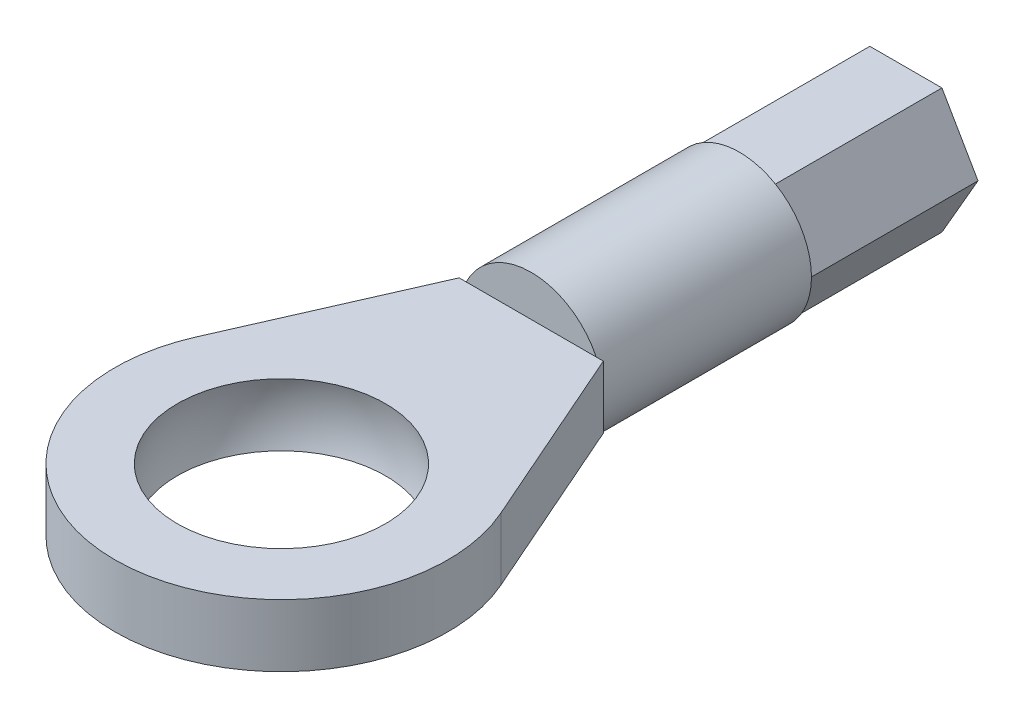
ISO-10303-21;
HEADER;
FILE_DESCRIPTION(('STEP AP214'),'2;1');
FILE_NAME('part.step','',(''),(''),'','','');
FILE_SCHEMA(('AUTOMOTIVE_DESIGN { 1 0 10303 214 1 1 1 1 }'));
ENDSEC;
DATA;
#1=APPLICATION_CONTEXT('core data for automotive mechanical design processes');
#2=APPLICATION_PROTOCOL_DEFINITION('international standard','automotive_design',2000,#1);
#3=PRODUCT_CONTEXT('',#1,'mechanical');
#4=PRODUCT('Part','Part','',(#3));
#5=PRODUCT_RELATED_PRODUCT_CATEGORY('part','',(#4));
#6=PRODUCT_DEFINITION_FORMATION('','',#4);
#7=PRODUCT_DEFINITION_CONTEXT('part definition',#1,'design');
#8=PRODUCT_DEFINITION('design','',#6,#7);
#9=PRODUCT_DEFINITION_SHAPE('','',#8);
#10=(LENGTH_UNIT() NAMED_UNIT(*) SI_UNIT(.MILLI.,.METRE.));
#11=(NAMED_UNIT(*) PLANE_ANGLE_UNIT() SI_UNIT($,.RADIAN.));
#12=(NAMED_UNIT(*) SI_UNIT($,.STERADIAN.) SOLID_ANGLE_UNIT());
#13=UNCERTAINTY_MEASURE_WITH_UNIT(LENGTH_MEASURE(1.E-05),#10,'distance_accuracy_value','');
#14=(GEOMETRIC_REPRESENTATION_CONTEXT(3) GLOBAL_UNCERTAINTY_ASSIGNED_CONTEXT((#13)) GLOBAL_UNIT_ASSIGNED_CONTEXT((#10,
#11,#12)) REPRESENTATION_CONTEXT('',''));
#15=CARTESIAN_POINT('',(0.,0.,0.));
#16=DIRECTION('',(0.,0.,1.));
#17=DIRECTION('',(1.,0.,0.));
#18=AXIS2_PLACEMENT_3D('',#15,#16,#17);
#19=CARTESIAN_POINT('',(0.,0.,9.));
#20=DIRECTION('',(0.,0.,1.));
#21=DIRECTION('',(1.,0.,0.));
#22=AXIS2_PLACEMENT_3D('',#19,#20,#21);
#23=PLANE('',#22);
#24=CARTESIAN_POINT('',(0.,0.,9.));
#25=DIRECTION('',(0.,0.,1.));
#26=DIRECTION('',(1.,0.,0.));
#27=AXIS2_PLACEMENT_3D('',#24,#25,#26);
#28=CIRCLE('',#27,1.73205080756888);
#29=CARTESIAN_POINT('',(-1.5612494995996,-0.75,9.));
#30=VERTEX_POINT('',#29);
#31=CARTESIAN_POINT('',(1.5612494995996,-0.75,9.));
#32=VERTEX_POINT('',#31);
#33=EDGE_CURVE('E282',#30,#32,#28,.T.);
#34=ORIENTED_EDGE('',*,*,#33,.T.);
#35=DIRECTION('',(-1.,0.,0.));
#36=VECTOR('',#35,1.);
#37=CARTESIAN_POINT('',(-1.73205080756888,-0.75,9.));
#38=LINE('',#37,#36);
#39=EDGE_CURVE('E43',#32,#30,#38,.T.);
#40=ORIENTED_EDGE('',*,*,#39,.T.);
#41=EDGE_LOOP('',(#34,#40));
#42=FACE_BOUND('',#41,.T.);
#43=ADVANCED_FACE('F34',(#42),#23,.T.);
#44=CARTESIAN_POINT('',(0.,0.,0.));
#45=DIRECTION('',(0.,0.,1.));
#46=DIRECTION('',(1.,0.,0.));
#47=AXIS2_PLACEMENT_3D('',#44,#45,#46);
#48=PLANE('',#47);
#49=DIRECTION('',(-0.5,0.866025403784439,0.));
#50=VECTOR('',#49,1.);
#51=CARTESIAN_POINT('',(1.73205080756888,0.,0.));
#52=LINE('',#51,#50);
#53=CARTESIAN_POINT('',(1.73205080756888,0.,0.));
#54=VERTEX_POINT('',#53);
#55=CARTESIAN_POINT('',(0.866025403784439,1.5,0.));
#56=VERTEX_POINT('',#55);
#57=EDGE_CURVE('E160',#54,#56,#52,.T.);
#58=ORIENTED_EDGE('',*,*,#57,.F.);
#59=DIRECTION('',(0.5,0.866025403784439,0.));
#60=VECTOR('',#59,1.);
#61=CARTESIAN_POINT('',(0.866025403784439,-1.5,0.));
#62=LINE('',#61,#60);
#63=CARTESIAN_POINT('',(0.866025403784439,-1.5,0.));
#64=VERTEX_POINT('',#63);
#65=EDGE_CURVE('E89',#64,#54,#62,.T.);
#66=ORIENTED_EDGE('',*,*,#65,.F.);
#67=DIRECTION('',(1.,0.,0.));
#68=VECTOR('',#67,1.);
#69=CARTESIAN_POINT('',(-0.866025403784437,-1.5,0.));
#70=LINE('',#69,#68);
#71=CARTESIAN_POINT('',(-0.866025403784437,-1.5,0.));
#72=VERTEX_POINT('',#71);
#73=EDGE_CURVE('E178',#72,#64,#70,.T.);
#74=ORIENTED_EDGE('',*,*,#73,.F.);
#75=DIRECTION('',(0.5,-0.866025403784439,0.));
#76=VECTOR('',#75,1.);
#77=CARTESIAN_POINT('',(-1.73205080756888,0.,0.));
#78=LINE('',#77,#76);
#79=CARTESIAN_POINT('',(-1.73205080756888,0.,0.));
#80=VERTEX_POINT('',#79);
#81=EDGE_CURVE('E176',#80,#72,#78,.T.);
#82=ORIENTED_EDGE('',*,*,#81,.F.);
#83=DIRECTION('',(-0.5,-0.866025403784439,0.));
#84=VECTOR('',#83,1.);
#85=CARTESIAN_POINT('',(-0.866025403784438,1.5,0.));
#86=LINE('',#85,#84);
#87=CARTESIAN_POINT('',(-0.866025403784438,1.5,0.));
#88=VERTEX_POINT('',#87);
#89=EDGE_CURVE('E114',#88,#80,#86,.T.);
#90=ORIENTED_EDGE('',*,*,#89,.F.);
#91=DIRECTION('',(-1.,0.,0.));
#92=VECTOR('',#91,1.);
#93=CARTESIAN_POINT('',(0.866025403784439,1.5,0.));
#94=LINE('',#93,#92);
#95=EDGE_CURVE('E173',#56,#88,#94,.T.);
#96=ORIENTED_EDGE('',*,*,#95,.F.);
#97=EDGE_LOOP('',(#58,#66,#74,#82,#90,#96));
#98=FACE_BOUND('',#97,.T.);
#99=CARTESIAN_POINT('',(0.,0.,0.));
#100=DIRECTION('',(0.,0.,1.));
#101=DIRECTION('',(1.,0.,0.));
#102=AXIS2_PLACEMENT_3D('',#99,#100,#101);
#103=CIRCLE('',#102,1.);
#104=CARTESIAN_POINT('',(1.,0.,0.));
#105=VERTEX_POINT('',#104);
#106=EDGE_CURVE('E157',#105,#105,#103,.T.);
#107=ORIENTED_EDGE('',*,*,#106,.T.);
#108=EDGE_LOOP('',(#107));
#109=FACE_BOUND('',#108,.T.);
#110=ADVANCED_FACE('F322',(#98,#109),#48,.F.);
#111=CARTESIAN_POINT('',(1.73205080756888,0.,4.));
#112=DIRECTION('',(-0.866025403784439,-0.5,0.));
#113=DIRECTION('',(0.5,-0.866025403784439,0.));
#114=AXIS2_PLACEMENT_3D('',#111,#112,#113);
#115=PLANE('',#114);
#116=ORIENTED_EDGE('',*,*,#57,.T.);
#117=DIRECTION('',(0.,0.,-1.));
#118=VECTOR('',#117,1.);
#119=CARTESIAN_POINT('',(0.866025403784439,1.5,4.));
#120=LINE('',#119,#118);
#121=CARTESIAN_POINT('',(0.866025403784439,1.5,4.));
#122=VERTEX_POINT('',#121);
#123=EDGE_CURVE('E38',#122,#56,#120,.T.);
#124=ORIENTED_EDGE('',*,*,#123,.F.);
#125=DIRECTION('',(-0.5,0.866025403784439,0.));
#126=VECTOR('',#125,1.);
#127=CARTESIAN_POINT('',(1.73205080756888,0.,4.));
#128=LINE('',#127,#126);
#129=CARTESIAN_POINT('',(1.73205080756888,0.,4.));
#130=VERTEX_POINT('',#129);
#131=EDGE_CURVE('E161',#130,#122,#128,.T.);
#132=ORIENTED_EDGE('',*,*,#131,.F.);
#133=DIRECTION('',(0.,0.,-1.));
#134=VECTOR('',#133,1.);
#135=CARTESIAN_POINT('',(1.73205080756888,0.,4.));
#136=LINE('',#135,#134);
#137=EDGE_CURVE('E170',#130,#54,#136,.T.);
#138=ORIENTED_EDGE('',*,*,#137,.T.);
#139=EDGE_LOOP('',(#116,#124,#132,#138));
#140=FACE_BOUND('',#139,.T.);
#141=ADVANCED_FACE('F36',(#140),#115,.F.);
#142=CARTESIAN_POINT('',(0.866025403784439,1.5,4.));
#143=DIRECTION('',(0.,-1.,0.));
#144=DIRECTION('',(1.,0.,0.));
#145=AXIS2_PLACEMENT_3D('',#142,#143,#144);
#146=PLANE('',#145);
#147=ORIENTED_EDGE('',*,*,#95,.T.);
#148=DIRECTION('',(0.,0.,-1.));
#149=VECTOR('',#148,1.);
#150=CARTESIAN_POINT('',(-0.866025403784438,1.5,4.));
#151=LINE('',#150,#149);
#152=CARTESIAN_POINT('',(-0.866025403784438,1.5,4.));
#153=VERTEX_POINT('',#152);
#154=EDGE_CURVE('E117',#153,#88,#151,.T.);
#155=ORIENTED_EDGE('',*,*,#154,.F.);
#156=DIRECTION('',(-1.,0.,0.));
#157=VECTOR('',#156,1.);
#158=CARTESIAN_POINT('',(0.866025403784439,1.5,4.));
#159=LINE('',#158,#157);
#160=EDGE_CURVE('E98',#122,#153,#159,.T.);
#161=ORIENTED_EDGE('',*,*,#160,.F.);
#162=ORIENTED_EDGE('',*,*,#123,.T.);
#163=EDGE_LOOP('',(#147,#155,#161,#162));
#164=FACE_BOUND('',#163,.T.);
#165=ADVANCED_FACE('F349',(#164),#146,.F.);
#166=CARTESIAN_POINT('',(-0.866025403784438,1.5,4.));
#167=DIRECTION('',(0.866025403784439,-0.5,0.));
#168=DIRECTION('',(0.5,0.866025403784439,0.));
#169=AXIS2_PLACEMENT_3D('',#166,#167,#168);
#170=PLANE('',#169);
#171=ORIENTED_EDGE('',*,*,#89,.T.);
#172=DIRECTION('',(0.,0.,-1.));
#173=VECTOR('',#172,1.);
#174=CARTESIAN_POINT('',(-1.73205080756888,0.,4.));
#175=LINE('',#174,#173);
#176=CARTESIAN_POINT('',(-1.73205080756888,0.,4.));
#177=VERTEX_POINT('',#176);
#178=EDGE_CURVE('E107',#177,#80,#175,.T.);
#179=ORIENTED_EDGE('',*,*,#178,.F.);
#180=DIRECTION('',(-0.5,-0.866025403784439,0.));
#181=VECTOR('',#180,1.);
#182=CARTESIAN_POINT('',(-0.866025403784438,1.5,4.));
#183=LINE('',#182,#181);
#184=EDGE_CURVE('E112',#153,#177,#183,.T.);
#185=ORIENTED_EDGE('',*,*,#184,.F.);
#186=ORIENTED_EDGE('',*,*,#154,.T.);
#187=EDGE_LOOP('',(#171,#179,#185,#186));
#188=FACE_BOUND('',#187,.T.);
#189=ADVANCED_FACE('F109',(#188),#170,.F.);
#190=CARTESIAN_POINT('',(-1.73205080756888,0.,4.));
#191=DIRECTION('',(0.866025403784439,0.5,0.));
#192=DIRECTION('',(-0.5,0.866025403784439,0.));
#193=AXIS2_PLACEMENT_3D('',#190,#191,#192);
#194=PLANE('',#193);
#195=ORIENTED_EDGE('',*,*,#81,.T.);
#196=DIRECTION('',(0.,0.,-1.));
#197=VECTOR('',#196,1.);
#198=CARTESIAN_POINT('',(-0.866025403784437,-1.5,4.));
#199=LINE('',#198,#197);
#200=CARTESIAN_POINT('',(-0.866025403784437,-1.5,4.));
#201=VERTEX_POINT('',#200);
#202=EDGE_CURVE('E118',#201,#72,#199,.T.);
#203=ORIENTED_EDGE('',*,*,#202,.F.);
#204=DIRECTION('',(0.5,-0.866025403784439,0.));
#205=VECTOR('',#204,1.);
#206=CARTESIAN_POINT('',(-1.73205080756888,0.,4.));
#207=LINE('',#206,#205);
#208=EDGE_CURVE('E121',#177,#201,#207,.T.);
#209=ORIENTED_EDGE('',*,*,#208,.F.);
#210=ORIENTED_EDGE('',*,*,#178,.T.);
#211=EDGE_LOOP('',(#195,#203,#209,#210));
#212=FACE_BOUND('',#211,.T.);
#213=ADVANCED_FACE('F122',(#212),#194,.F.);
#214=CARTESIAN_POINT('',(-0.866025403784437,-1.5,4.));
#215=DIRECTION('',(0.,1.,0.));
#216=DIRECTION('',(-1.,0.,0.));
#217=AXIS2_PLACEMENT_3D('',#214,#215,#216);
#218=PLANE('',#217);
#219=ORIENTED_EDGE('',*,*,#73,.T.);
#220=DIRECTION('',(0.,0.,-1.));
#221=VECTOR('',#220,1.);
#222=CARTESIAN_POINT('',(0.866025403784439,-1.5,4.));
#223=LINE('',#222,#221);
#224=CARTESIAN_POINT('',(0.866025403784439,-1.5,4.));
#225=VERTEX_POINT('',#224);
#226=EDGE_CURVE('E62',#225,#64,#223,.T.);
#227=ORIENTED_EDGE('',*,*,#226,.F.);
#228=DIRECTION('',(1.,0.,0.));
#229=VECTOR('',#228,1.);
#230=CARTESIAN_POINT('',(-0.866025403784437,-1.5,4.));
#231=LINE('',#230,#229);
#232=EDGE_CURVE('E127',#201,#225,#231,.T.);
#233=ORIENTED_EDGE('',*,*,#232,.F.);
#234=ORIENTED_EDGE('',*,*,#202,.T.);
#235=EDGE_LOOP('',(#219,#227,#233,#234));
#236=FACE_BOUND('',#235,.T.);
#237=ADVANCED_FACE('F343',(#236),#218,.F.);
#238=CARTESIAN_POINT('',(0.866025403784439,-1.5,4.));
#239=DIRECTION('',(-0.866025403784439,0.5,0.));
#240=DIRECTION('',(-0.5,-0.866025403784439,0.));
#241=AXIS2_PLACEMENT_3D('',#238,#239,#240);
#242=PLANE('',#241);
#243=ORIENTED_EDGE('',*,*,#65,.T.);
#244=ORIENTED_EDGE('',*,*,#137,.F.);
#245=DIRECTION('',(0.5,0.866025403784439,0.));
#246=VECTOR('',#245,1.);
#247=CARTESIAN_POINT('',(0.866025403784439,-1.5,4.));
#248=LINE('',#247,#246);
#249=EDGE_CURVE('E167',#225,#130,#248,.T.);
#250=ORIENTED_EDGE('',*,*,#249,.F.);
#251=ORIENTED_EDGE('',*,*,#226,.T.);
#252=EDGE_LOOP('',(#243,#244,#250,#251));
#253=FACE_BOUND('',#252,.T.);
#254=ADVANCED_FACE('F299',(#253),#242,.F.);
#255=CARTESIAN_POINT('',(0.,0.,4.));
#256=DIRECTION('',(0.,0.,-1.));
#257=DIRECTION('',(-1.,0.,0.));
#258=AXIS2_PLACEMENT_3D('',#255,#256,#257);
#259=CYLINDRICAL_SURFACE('',#258,1.);
#260=CARTESIAN_POINT('',(0.,0.,4.));
#261=DIRECTION('',(0.,0.,1.));
#262=DIRECTION('',(1.,0.,0.));
#263=AXIS2_PLACEMENT_3D('',#260,#261,#262);
#264=CIRCLE('',#263,1.);
#265=CARTESIAN_POINT('',(1.,0.,4.));
#266=VERTEX_POINT('',#265);
#267=EDGE_CURVE('E154',#266,#266,#264,.T.);
#268=ORIENTED_EDGE('',*,*,#267,.T.);
#269=EDGE_LOOP('',(#268));
#270=FACE_BOUND('',#269,.T.);
#271=ORIENTED_EDGE('',*,*,#106,.F.);
#272=EDGE_LOOP('',(#271));
#273=FACE_BOUND('',#272,.T.);
#274=ADVANCED_FACE('F314',(#270,#273),#259,.F.);
#275=CARTESIAN_POINT('',(0.,0.,4.));
#276=DIRECTION('',(0.,0.,1.));
#277=DIRECTION('',(1.,0.,0.));
#278=AXIS2_PLACEMENT_3D('',#275,#276,#277);
#279=PLANE('',#278);
#280=ORIENTED_EDGE('',*,*,#267,.F.);
#281=EDGE_LOOP('',(#280));
#282=FACE_BOUND('',#281,.T.);
#283=ADVANCED_FACE('F307',(#282),#279,.F.);
#284=CARTESIAN_POINT('',(0.,0.,4.));
#285=DIRECTION('',(0.,0.,1.));
#286=DIRECTION('',(1.,0.,0.));
#287=AXIS2_PLACEMENT_3D('',#284,#285,#286);
#288=CIRCLE('',#287,1.73205080756888);
#289=EDGE_CURVE('E147',#130,#122,#288,.T.);
#290=ORIENTED_EDGE('',*,*,#289,.F.);
#291=ORIENTED_EDGE('',*,*,#131,.T.);
#292=EDGE_LOOP('',(#290,#291));
#293=FACE_BOUND('',#292,.T.);
#294=ADVANCED_FACE('F304',(#293),#279,.F.);
#295=EDGE_CURVE('E146',#122,#153,#288,.T.);
#296=ORIENTED_EDGE('',*,*,#295,.F.);
#297=ORIENTED_EDGE('',*,*,#160,.T.);
#298=EDGE_LOOP('',(#296,#297));
#299=FACE_BOUND('',#298,.T.);
#300=ADVANCED_FACE('F306',(#299),#279,.F.);
#301=EDGE_CURVE('E133',#153,#177,#288,.T.);
#302=ORIENTED_EDGE('',*,*,#301,.F.);
#303=ORIENTED_EDGE('',*,*,#184,.T.);
#304=EDGE_LOOP('',(#302,#303));
#305=FACE_BOUND('',#304,.T.);
#306=ADVANCED_FACE('F131',(#305),#279,.F.);
#307=EDGE_CURVE('E137',#177,#201,#288,.T.);
#308=ORIENTED_EDGE('',*,*,#307,.F.);
#309=ORIENTED_EDGE('',*,*,#208,.T.);
#310=EDGE_LOOP('',(#308,#309));
#311=FACE_BOUND('',#310,.T.);
#312=ADVANCED_FACE('F138',(#311),#279,.F.);
#313=EDGE_CURVE('E141',#201,#225,#288,.T.);
#314=ORIENTED_EDGE('',*,*,#313,.F.);
#315=ORIENTED_EDGE('',*,*,#232,.T.);
#316=EDGE_LOOP('',(#314,#315));
#317=FACE_BOUND('',#316,.T.);
#318=ADVANCED_FACE('F316',(#317),#279,.F.);
#319=CARTESIAN_POINT('',(0.,0.,9.));
#320=DIRECTION('',(0.,0.,-1.));
#321=DIRECTION('',(-1.,0.,0.));
#322=AXIS2_PLACEMENT_3D('',#319,#320,#321);
#323=CYLINDRICAL_SURFACE('',#322,1.73205080756888);
#324=CARTESIAN_POINT('',(1.73205080756888,0.,9.));
#325=VERTEX_POINT('',#324);
#326=CARTESIAN_POINT('',(1.5612494995996,0.75,9.));
#327=VERTEX_POINT('',#326);
#328=EDGE_CURVE('E152',#325,#327,#28,.T.);
#329=ORIENTED_EDGE('',*,*,#328,.F.);
#330=EDGE_CURVE('E150',#32,#325,#28,.T.);
#331=ORIENTED_EDGE('',*,*,#330,.F.);
#332=ORIENTED_EDGE('',*,*,#33,.F.);
#333=CARTESIAN_POINT('',(-1.73205080756888,0.,9.));
#334=VERTEX_POINT('',#333);
#335=EDGE_CURVE('E269',#334,#30,#28,.T.);
#336=ORIENTED_EDGE('',*,*,#335,.F.);
#337=CARTESIAN_POINT('',(-1.5612494995996,0.75,9.));
#338=VERTEX_POINT('',#337);
#339=EDGE_CURVE('E280',#338,#334,#28,.T.);
#340=ORIENTED_EDGE('',*,*,#339,.F.);
#341=EDGE_CURVE('E283',#327,#338,#28,.T.);
#342=ORIENTED_EDGE('',*,*,#341,.F.);
#343=EDGE_LOOP('',(#329,#331,#332,#336,#340,#342));
#344=FACE_BOUND('',#343,.T.);
#345=ORIENTED_EDGE('',*,*,#289,.T.);
#346=ORIENTED_EDGE('',*,*,#295,.T.);
#347=ORIENTED_EDGE('',*,*,#301,.T.);
#348=ORIENTED_EDGE('',*,*,#307,.T.);
#349=ORIENTED_EDGE('',*,*,#313,.T.);
#350=EDGE_CURVE('E151',#225,#130,#288,.T.);
#351=ORIENTED_EDGE('',*,*,#350,.T.);
#352=EDGE_LOOP('',(#345,#346,#347,#348,#349,#351));
#353=FACE_BOUND('',#352,.T.);
#354=ADVANCED_FACE('F144',(#344,#353),#323,.T.);
#355=DIRECTION('',(-1.,0.,0.));
#356=VECTOR('',#355,1.);
#357=CARTESIAN_POINT('',(-1.73205080756888,0.75,9.));
#358=LINE('',#357,#356);
#359=EDGE_CURVE('E11',#327,#338,#358,.T.);
#360=ORIENTED_EDGE('',*,*,#359,.F.);
#361=ORIENTED_EDGE('',*,*,#341,.T.);
#362=EDGE_LOOP('',(#360,#361));
#363=FACE_BOUND('',#362,.T.);
#364=ADVANCED_FACE('F289',(#363),#23,.T.);
#365=ORIENTED_EDGE('',*,*,#350,.F.);
#366=ORIENTED_EDGE('',*,*,#249,.T.);
#367=EDGE_LOOP('',(#365,#366));
#368=FACE_BOUND('',#367,.T.);
#369=ADVANCED_FACE('F303',(#368),#279,.F.);
#370=CARTESIAN_POINT('',(-1.73205080756888,-0.75,9.));
#371=DIRECTION('',(0.,0.,-1.));
#372=DIRECTION('',(-1.,0.,0.));
#373=AXIS2_PLACEMENT_3D('',#370,#371,#372);
#374=PLANE('',#373);
#375=CARTESIAN_POINT('',(-1.73205080756888,0.75,9.));
#376=VERTEX_POINT('',#375);
#377=EDGE_CURVE('E46',#338,#376,#358,.T.);
#378=ORIENTED_EDGE('',*,*,#377,.F.);
#379=ORIENTED_EDGE('',*,*,#339,.T.);
#380=DIRECTION('',(0.,1.,0.));
#381=VECTOR('',#380,1.);
#382=CARTESIAN_POINT('',(-1.73205080756888,-0.75,9.));
#383=LINE('',#382,#381);
#384=EDGE_CURVE('E255',#334,#376,#383,.T.);
#385=ORIENTED_EDGE('',*,*,#384,.T.);
#386=EDGE_LOOP('',(#378,#379,#385));
#387=FACE_BOUND('',#386,.T.);
#388=ADVANCED_FACE('F320',(#387),#374,.T.);
#389=CARTESIAN_POINT('',(-1.73205080756888,-0.75,9.));
#390=VERTEX_POINT('',#389);
#391=EDGE_CURVE('E259',#390,#334,#383,.T.);
#392=ORIENTED_EDGE('',*,*,#391,.T.);
#393=ORIENTED_EDGE('',*,*,#335,.T.);
#394=EDGE_CURVE('E53',#30,#390,#38,.T.);
#395=ORIENTED_EDGE('',*,*,#394,.T.);
#396=EDGE_LOOP('',(#392,#393,#395));
#397=FACE_BOUND('',#396,.T.);
#398=ADVANCED_FACE('F268',(#397),#374,.T.);
#399=DIRECTION('',(0.,1.,0.));
#400=VECTOR('',#399,1.);
#401=CARTESIAN_POINT('',(1.73205080756888,-0.75,9.));
#402=LINE('',#401,#400);
#403=CARTESIAN_POINT('',(1.73205080756888,0.75,9.));
#404=VERTEX_POINT('',#403);
#405=EDGE_CURVE('E263',#325,#404,#402,.T.);
#406=ORIENTED_EDGE('',*,*,#405,.F.);
#407=ORIENTED_EDGE('',*,*,#328,.T.);
#408=EDGE_CURVE('E45',#404,#327,#358,.T.);
#409=ORIENTED_EDGE('',*,*,#408,.F.);
#410=EDGE_LOOP('',(#406,#407,#409));
#411=FACE_BOUND('',#410,.T.);
#412=ADVANCED_FACE('F447',(#411),#374,.T.);
#413=CARTESIAN_POINT('',(1.73205080756888,-0.75,9.));
#414=VERTEX_POINT('',#413);
#415=EDGE_CURVE('E185',#414,#32,#38,.T.);
#416=ORIENTED_EDGE('',*,*,#415,.T.);
#417=ORIENTED_EDGE('',*,*,#330,.T.);
#418=EDGE_CURVE('E250',#414,#325,#402,.T.);
#419=ORIENTED_EDGE('',*,*,#418,.F.);
#420=EDGE_LOOP('',(#416,#417,#419));
#421=FACE_BOUND('',#420,.T.);
#422=ADVANCED_FACE('F439',(#421),#374,.T.);
#423=CARTESIAN_POINT('',(1.73205080756888,-0.75,9.));
#424=DIRECTION('',(0.915466471029534,0.,-0.402394259925178));
#425=DIRECTION('',(-0.402394259925178,0.,-0.915466471029534));
#426=AXIS2_PLACEMENT_3D('',#423,#424,#425);
#427=PLANE('',#426);
#428=ORIENTED_EDGE('',*,*,#418,.T.);
#429=ORIENTED_EDGE('',*,*,#405,.T.);
#430=DIRECTION('',(-0.402394259925178,0.,-0.915466471029534));
#431=VECTOR('',#430,1.);
#432=CARTESIAN_POINT('',(1.73205080756888,0.75,9.));
#433=LINE('',#432,#431);
#434=CARTESIAN_POINT('',(3.66186588411814,0.75,13.3904229602993));
#435=VERTEX_POINT('',#434);
#436=EDGE_CURVE('E193',#435,#404,#433,.T.);
#437=ORIENTED_EDGE('',*,*,#436,.F.);
#438=DIRECTION('',(0.,1.,0.));
#439=VECTOR('',#438,1.);
#440=CARTESIAN_POINT('',(3.66186588411814,-0.75,13.3904229602993));
#441=LINE('',#440,#439);
#442=CARTESIAN_POINT('',(3.66186588411814,-0.75,13.3904229602993));
#443=VERTEX_POINT('',#442);
#444=EDGE_CURVE('E253',#443,#435,#441,.T.);
#445=ORIENTED_EDGE('',*,*,#444,.F.);
#446=DIRECTION('',(-0.402394259925178,0.,-0.915466471029534));
#447=VECTOR('',#446,1.);
#448=CARTESIAN_POINT('',(1.73205080756888,-0.75,9.));
#449=LINE('',#448,#447);
#450=EDGE_CURVE('E236',#443,#414,#449,.T.);
#451=ORIENTED_EDGE('',*,*,#450,.T.);
#452=EDGE_LOOP('',(#428,#429,#437,#445,#451));
#453=FACE_BOUND('',#452,.T.);
#454=ADVANCED_FACE('F247',(#453),#427,.T.);
#455=CARTESIAN_POINT('',(0.,-0.75,15.));
#456=DIRECTION('',(0.,1.,0.));
#457=DIRECTION('',(0.,0.,1.));
#458=AXIS2_PLACEMENT_3D('',#455,#456,#457);
#459=CYLINDRICAL_SURFACE('',#458,4.);
#460=ORIENTED_EDGE('',*,*,#444,.T.);
#461=CARTESIAN_POINT('',(0.,0.75,15.));
#462=DIRECTION('',(0.,1.,0.));
#463=DIRECTION('',(0.,0.,1.));
#464=AXIS2_PLACEMENT_3D('',#461,#462,#463);
#465=CIRCLE('',#464,4.);
#466=CARTESIAN_POINT('',(-3.66186588411814,0.75,13.3904229602993));
#467=VERTEX_POINT('',#466);
#468=EDGE_CURVE('E199',#467,#435,#465,.T.);
#469=ORIENTED_EDGE('',*,*,#468,.F.);
#470=DIRECTION('',(0.,1.,0.));
#471=VECTOR('',#470,1.);
#472=CARTESIAN_POINT('',(-3.66186588411814,-0.75,13.3904229602993));
#473=LINE('',#472,#471);
#474=CARTESIAN_POINT('',(-3.66186588411814,-0.75,13.3904229602993));
#475=VERTEX_POINT('',#474);
#476=EDGE_CURVE('E265',#475,#467,#473,.T.);
#477=ORIENTED_EDGE('',*,*,#476,.F.);
#478=CARTESIAN_POINT('',(0.,-0.75,15.));
#479=DIRECTION('',(0.,1.,0.));
#480=DIRECTION('',(0.,0.,1.));
#481=AXIS2_PLACEMENT_3D('',#478,#479,#480);
#482=CIRCLE('',#481,4.);
#483=EDGE_CURVE('E256',#475,#443,#482,.T.);
#484=ORIENTED_EDGE('',*,*,#483,.T.);
#485=EDGE_LOOP('',(#460,#469,#477,#484));
#486=FACE_BOUND('',#485,.T.);
#487=ADVANCED_FACE('F469',(#486),#459,.T.);
#488=CARTESIAN_POINT('',(-1.73205080756888,-0.75,9.));
#489=DIRECTION('',(-0.915466471029534,0.,-0.402394259925177));
#490=DIRECTION('',(-0.402394259925177,0.,0.915466471029534));
#491=AXIS2_PLACEMENT_3D('',#488,#489,#490);
#492=PLANE('',#491);
#493=ORIENTED_EDGE('',*,*,#476,.T.);
#494=DIRECTION('',(-0.402394259925177,0.,0.915466471029534));
#495=VECTOR('',#494,1.);
#496=CARTESIAN_POINT('',(-1.73205080756888,0.75,9.));
#497=LINE('',#496,#495);
#498=EDGE_CURVE('E206',#376,#467,#497,.T.);
#499=ORIENTED_EDGE('',*,*,#498,.F.);
#500=ORIENTED_EDGE('',*,*,#384,.F.);
#501=ORIENTED_EDGE('',*,*,#391,.F.);
#502=DIRECTION('',(-0.402394259925177,0.,0.915466471029534));
#503=VECTOR('',#502,1.);
#504=CARTESIAN_POINT('',(-1.73205080756888,-0.75,9.));
#505=LINE('',#504,#503);
#506=EDGE_CURVE('E192',#390,#475,#505,.T.);
#507=ORIENTED_EDGE('',*,*,#506,.T.);
#508=EDGE_LOOP('',(#493,#499,#500,#501,#507));
#509=FACE_BOUND('',#508,.T.);
#510=ADVANCED_FACE('F228',(#509),#492,.T.);
#511=CARTESIAN_POINT('',(0.,-0.75,15.));
#512=DIRECTION('',(0.,1.,0.));
#513=DIRECTION('',(0.,0.,1.));
#514=AXIS2_PLACEMENT_3D('',#511,#512,#513);
#515=PLANE('',#514);
#516=CARTESIAN_POINT('',(0.,-0.749999999999999,15.));
#517=DIRECTION('',(0.,1.,0.));
#518=DIRECTION('',(0.,0.,1.));
#519=AXIS2_PLACEMENT_3D('',#516,#517,#518);
#520=CIRCLE('',#519,2.5);
#521=CARTESIAN_POINT('',(0.,-0.749999999999999,17.5));
#522=VERTEX_POINT('',#521);
#523=EDGE_CURVE('E211',#522,#522,#520,.F.);
#524=ORIENTED_EDGE('',*,*,#523,.F.);
#525=EDGE_LOOP('',(#524));
#526=FACE_BOUND('',#525,.T.);
#527=ORIENTED_EDGE('',*,*,#415,.F.);
#528=ORIENTED_EDGE('',*,*,#450,.F.);
#529=ORIENTED_EDGE('',*,*,#483,.F.);
#530=ORIENTED_EDGE('',*,*,#506,.F.);
#531=ORIENTED_EDGE('',*,*,#394,.F.);
#532=ORIENTED_EDGE('',*,*,#39,.F.);
#533=EDGE_LOOP('',(#527,#528,#529,#530,#531,#532));
#534=FACE_BOUND('',#533,.T.);
#535=ADVANCED_FACE('F226',(#526,#534),#515,.F.);
#536=CARTESIAN_POINT('',(0.,0.75,15.));
#537=DIRECTION('',(0.,1.,0.));
#538=DIRECTION('',(0.,0.,1.));
#539=AXIS2_PLACEMENT_3D('',#536,#537,#538);
#540=PLANE('',#539);
#541=ORIENTED_EDGE('',*,*,#408,.T.);
#542=ORIENTED_EDGE('',*,*,#359,.T.);
#543=ORIENTED_EDGE('',*,*,#377,.T.);
#544=ORIENTED_EDGE('',*,*,#498,.T.);
#545=ORIENTED_EDGE('',*,*,#468,.T.);
#546=ORIENTED_EDGE('',*,*,#436,.T.);
#547=EDGE_LOOP('',(#541,#542,#543,#544,#545,#546));
#548=FACE_BOUND('',#547,.T.);
#549=CARTESIAN_POINT('',(0.,0.75,15.));
#550=DIRECTION('',(0.,1.,0.));
#551=DIRECTION('',(0.,0.,1.));
#552=AXIS2_PLACEMENT_3D('',#549,#550,#551);
#553=CIRCLE('',#552,2.5);
#554=CARTESIAN_POINT('',(0.,0.75,17.5));
#555=VERTEX_POINT('',#554);
#556=EDGE_CURVE('E214',#555,#555,#553,.F.);
#557=ORIENTED_EDGE('',*,*,#556,.T.);
#558=EDGE_LOOP('',(#557));
#559=FACE_BOUND('',#558,.T.);
#560=ADVANCED_FACE('F218',(#548,#559),#540,.T.);
#561=CARTESIAN_POINT('',(0.,0.,15.));
#562=DIRECTION('',(0.,-1.,0.));
#563=DIRECTION('',(0.,0.,1.));
#564=AXIS2_PLACEMENT_3D('',#561,#562,#563);
#565=SPHERICAL_SURFACE('',#564,2.61007662722764);
#566=CARTESIAN_POINT('',(0.,0.75,17.5));
#567=CARTESIAN_POINT('',(0.,0.734819963271987,17.5045540289738));
#568=CARTESIAN_POINT('',(0.,0.719598439299122,17.5089697652429));
#569=CARTESIAN_POINT('',(0.,0.689077487984953,17.517523259908));
#570=CARTESIAN_POINT('',(0.,0.673778060643649,17.521661018304));
#571=CARTESIAN_POINT('',(0.,0.643106373713867,17.5296571647594));
#572=CARTESIAN_POINT('',(0.,0.627734114125389,17.5335155528188));
#573=CARTESIAN_POINT('',(0.,0.596921864915735,17.5409516835518));
#574=CARTESIAN_POINT('',(0.,0.58148187529456,17.5445294262253));
#575=CARTESIAN_POINT('',(0.,0.550539288851939,17.5514030776374));
#576=CARTESIAN_POINT('',(0.,0.535036692030493,17.5546989863759));
#577=CARTESIAN_POINT('',(0.,0.503974035291073,17.5610078766599));
#578=CARTESIAN_POINT('',(0.,0.488413975373098,17.5640208582054));
#579=CARTESIAN_POINT('',(0.,0.457241555478247,17.5697628942496));
#580=CARTESIAN_POINT('',(0.,0.441629195501371,17.5724919487483));
#581=CARTESIAN_POINT('',(0.,0.410357355916009,17.5776652251838));
#582=CARTESIAN_POINT('',(0.,0.394697876307523,17.5801094471206));
#583=CARTESIAN_POINT('',(0.,0.363336993511678,17.5847122473949));
#584=CARTESIAN_POINT('',(0.,0.34763559032432,17.5868708257324));
#585=CARTESIAN_POINT('',(0.,0.316196070336917,17.5909016225607));
#586=CARTESIAN_POINT('',(0.,0.300457953536872,17.5927738410516));
#587=CARTESIAN_POINT('',(0.,0.268950228471734,17.5962312969553));
#588=CARTESIAN_POINT('',(0.,0.25318062020664,17.5978165343682));
#589=CARTESIAN_POINT('',(0.,0.221615144808574,17.6006995021102));
#590=CARTESIAN_POINT('',(0.,0.205819277675602,17.6019972324394));
#591=CARTESIAN_POINT('',(0.,0.174206525851995,17.604304755407));
#592=CARTESIAN_POINT('',(0.,0.15838964116136,17.6053145480456));
#593=CARTESIAN_POINT('',(0.,0.126740102506602,17.6070458605674));
#594=CARTESIAN_POINT('',(0.,0.11090744854248,17.6077673804507));
#595=CARTESIAN_POINT('',(0.,0.0792316248574051,17.6089219080508));
#596=CARTESIAN_POINT('',(0.,0.0633884551364531,17.6093549157676));
#597=CARTESIAN_POINT('',(0.,0.0316968569436677,17.609932275356));
#598=CARTESIAN_POINT('',(0.,0.0158484284718342,17.6100766272276));
#599=CARTESIAN_POINT('',(0.,-0.0158484284718329,17.6100766272276));
#600=CARTESIAN_POINT('',(0.,-0.0316968569436664,17.609932275356));
#601=CARTESIAN_POINT('',(0.,-0.0633884551364519,17.6093549157676));
#602=CARTESIAN_POINT('',(0.,-0.0792316248574038,17.6089219080508));
#603=CARTESIAN_POINT('',(0.,-0.110907448542478,17.6077673804507));
#604=CARTESIAN_POINT('',(0.,-0.126740102506601,17.6070458605674));
#605=CARTESIAN_POINT('',(0.,-0.158389641161358,17.6053145480456));
#606=CARTESIAN_POINT('',(0.,-0.174206525851994,17.604304755407));
#607=CARTESIAN_POINT('',(0.,-0.205819277675601,17.6019972324394));
#608=CARTESIAN_POINT('',(0.,-0.221615144808573,17.6006995021102));
#609=CARTESIAN_POINT('',(0.,-0.253180620206639,17.5978165343682));
#610=CARTESIAN_POINT('',(0.,-0.268950228471732,17.5962312969553));
#611=CARTESIAN_POINT('',(0.,-0.300457953536871,17.5927738410516));
#612=CARTESIAN_POINT('',(0.,-0.316196070336916,17.5909016225607));
#613=CARTESIAN_POINT('',(0.,-0.347635590324319,17.5868708257324));
#614=CARTESIAN_POINT('',(0.,-0.363336993511677,17.5847122473949));
#615=CARTESIAN_POINT('',(0.,-0.394697876307522,17.5801094471206));
#616=CARTESIAN_POINT('',(0.,-0.410357355916008,17.5776652251838));
#617=CARTESIAN_POINT('',(0.,-0.44162919550137,17.5724919487483));
#618=CARTESIAN_POINT('',(0.,-0.457241555478246,17.5697628942496));
#619=CARTESIAN_POINT('',(0.,-0.488413975373097,17.5640208582054));
#620=CARTESIAN_POINT('',(0.,-0.503974035291071,17.5610078766599));
#621=CARTESIAN_POINT('',(0.,-0.535036692030492,17.5546989863759));
#622=CARTESIAN_POINT('',(0.,-0.550539288851938,17.5514030776374));
#623=CARTESIAN_POINT('',(0.,-0.581481875294559,17.5445294262253));
#624=CARTESIAN_POINT('',(0.,-0.596921864915734,17.5409516835518));
#625=CARTESIAN_POINT('',(0.,-0.627734114125388,17.5335155528188));
#626=CARTESIAN_POINT('',(0.,-0.643106373713866,17.5296571647594));
#627=CARTESIAN_POINT('',(0.,-0.673778060643648,17.521661018304));
#628=CARTESIAN_POINT('',(0.,-0.689077487984952,17.517523259908));
#629=CARTESIAN_POINT('',(0.,-0.719598439299121,17.5089697652429));
#630=CARTESIAN_POINT('',(0.,-0.734819963271986,17.5045540289738));
#631=CARTESIAN_POINT('',(0.,-0.749999999999999,17.5));
#632=B_SPLINE_CURVE_WITH_KNOTS('',3,(#566,#567,#568,#569,#570,#571,#572,#573,#574,#575,#576,
#577,#578,#579,#580,#581,#582,#583,#584,#585,#586,#587,#588,#589,#590,#591,#592,#593,#594,#595,
#596,#597,#598,#599,#600,#601,#602,#603,#604,#605,#606,#607,#608,#609,#610,#611,#612,#613,#614,
#615,#616,#617,#618,#619,#620,#621,#622,#623,#624,#625,#626,#627,#628,#629,#630,#631),
.UNSPECIFIED.,.F.,.F.,(4,2,2,2,2,2,2,2,2,2,2,2,2,2,2,2,2,2,2,2,2,2,2,2,2,2,2,2,2,2,2,2,4),(0.,
0.0475446280852742,0.0950892561705493,0.142633884255824,0.190178512341097,0.237723140426372,
0.285267768511647,0.332812396596921,0.380357024682195,0.427901652767469,0.475446280852744,
0.522990908938019,0.570535537023293,0.618080165108567,0.665624793193842,0.713169421279116,
0.76071404936439,0.808258677449665,0.855803305534939,0.903347933620214,0.950892561705488,
0.998437189790763,1.04598181787604,1.09352644596131,1.14107107404659,1.18861570213186,
1.23616033021713,1.28370495830241,1.33124958638768,1.37879421447296,1.42633884255823,
1.47388347064351,1.52142809872878),.UNSPECIFIED.);
#633=EDGE_CURVE('BSEAM220',#555,#522,#632,.T.);
#634=ORIENTED_EDGE('',*,*,#556,.F.);
#635=ORIENTED_EDGE('',*,*,#523,.T.);
#636=ORIENTED_EDGE('',*,*,#633,.T.);
#637=ORIENTED_EDGE('',*,*,#633,.F.);
#638=EDGE_LOOP('',(#634,#636,#635,#637));
#639=FACE_BOUND('',#638,.T.);
#640=ADVANCED_FACE('F220',(#639),#565,.F.);
#641=CLOSED_SHELL('',(#43,#110,#141,#165,#189,#213,#237,#254,#274,#283,#294,#300,#306,#312,#318,
#354,#364,#369,#388,#398,#412,#422,#454,#487,#510,#535,#560,#640));
#642=MANIFOLD_SOLID_BREP('B2',#641);
#643=ADVANCED_BREP_SHAPE_REPRESENTATION('',(#18,#642),#14);
#644=SHAPE_DEFINITION_REPRESENTATION(#9,#643);
ENDSEC;
END-ISO-10303-21;
